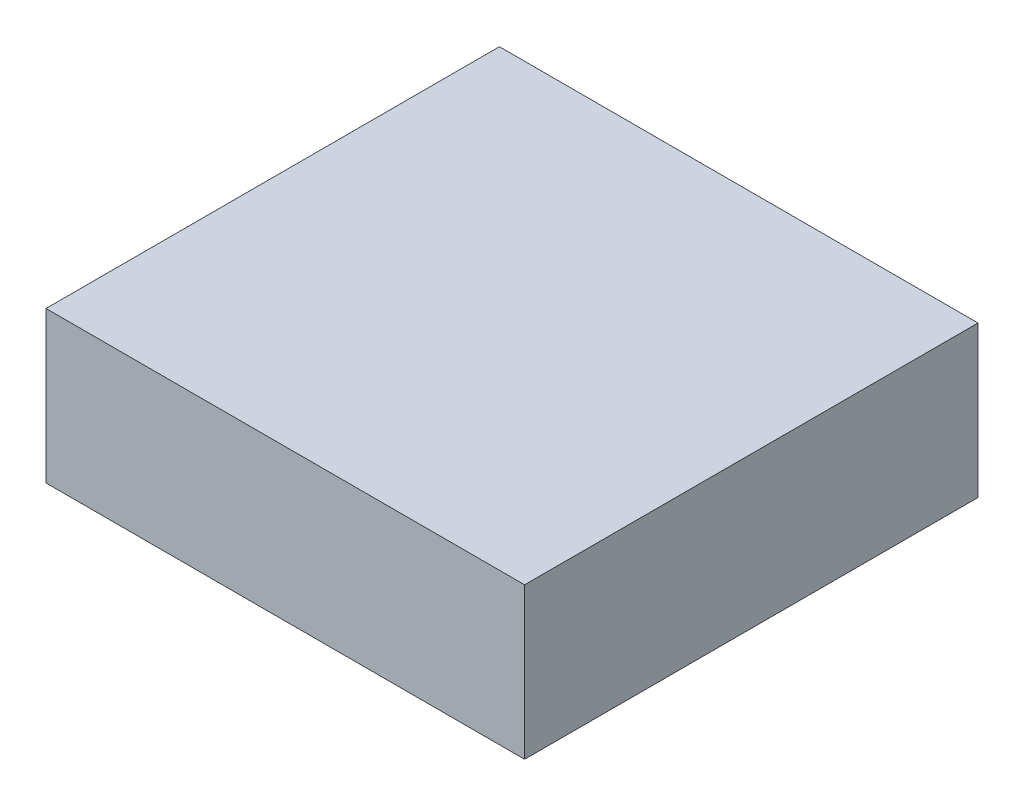
ISO-10303-21;
HEADER;
FILE_DESCRIPTION(('STEP AP214'),'2;1');
FILE_NAME('part.step','',(''),(''),'','','');
FILE_SCHEMA(('AUTOMOTIVE_DESIGN { 1 0 10303 214 1 1 1 1 }'));
ENDSEC;
DATA;
#1=APPLICATION_CONTEXT('core data for automotive mechanical design processes');
#2=APPLICATION_PROTOCOL_DEFINITION('international standard','automotive_design',2000,#1);
#3=PRODUCT_CONTEXT('',#1,'mechanical');
#4=PRODUCT('Part','Part','',(#3));
#5=PRODUCT_RELATED_PRODUCT_CATEGORY('part','',(#4));
#6=PRODUCT_DEFINITION_FORMATION('','',#4);
#7=PRODUCT_DEFINITION_CONTEXT('part definition',#1,'design');
#8=PRODUCT_DEFINITION('design','',#6,#7);
#9=PRODUCT_DEFINITION_SHAPE('','',#8);
#10=(LENGTH_UNIT() NAMED_UNIT(*) SI_UNIT(.MILLI.,.METRE.));
#11=(NAMED_UNIT(*) PLANE_ANGLE_UNIT() SI_UNIT($,.RADIAN.));
#12=(NAMED_UNIT(*) SI_UNIT($,.STERADIAN.) SOLID_ANGLE_UNIT());
#13=UNCERTAINTY_MEASURE_WITH_UNIT(LENGTH_MEASURE(1.E-05),#10,'distance_accuracy_value','');
#14=(GEOMETRIC_REPRESENTATION_CONTEXT(3) GLOBAL_UNCERTAINTY_ASSIGNED_CONTEXT((#13)) GLOBAL_UNIT_ASSIGNED_CONTEXT((#10,
#11,#12)) REPRESENTATION_CONTEXT('',''));
#15=CARTESIAN_POINT('',(0.,0.,0.));
#16=DIRECTION('',(0.,0.,1.));
#17=DIRECTION('',(1.,0.,0.));
#18=AXIS2_PLACEMENT_3D('',#15,#16,#17);
#19=CARTESIAN_POINT('',(0.47500032,0.15000224,0.));
#20=DIRECTION('',(0.,-1.,0.));
#21=DIRECTION('',(0.,0.,-1.));
#22=AXIS2_PLACEMENT_3D('',#19,#20,#21);
#23=PLANE('',#22);
#24=DIRECTION('',(0.,0.,-1.));
#25=VECTOR('',#24,1.);
#26=CARTESIAN_POINT('',(-0.47500032,0.15000224,0.));
#27=LINE('',#26,#25);
#28=CARTESIAN_POINT('',(-0.47500032,0.15000224,0.));
#29=VERTEX_POINT('',#28);
#30=CARTESIAN_POINT('',(-0.47500032,0.15000224,0.90000074));
#31=VERTEX_POINT('',#30);
#32=EDGE_CURVE('E20',#29,#31,#27,.F.);
#33=ORIENTED_EDGE('',*,*,#32,.T.);
#34=DIRECTION('',(-1.,0.,0.));
#35=VECTOR('',#34,1.);
#36=CARTESIAN_POINT('',(-0.47500032,0.15000224,0.90000074));
#37=LINE('',#36,#35);
#38=CARTESIAN_POINT('',(0.47500032,0.15000224,0.90000074));
#39=VERTEX_POINT('',#38);
#40=EDGE_CURVE('E55',#31,#39,#37,.F.);
#41=ORIENTED_EDGE('',*,*,#40,.T.);
#42=DIRECTION('',(0.,0.,1.));
#43=VECTOR('',#42,1.);
#44=CARTESIAN_POINT('',(0.47500032,0.15000224,0.));
#45=LINE('',#44,#43);
#46=CARTESIAN_POINT('',(0.47500032,0.15000224,0.));
#47=VERTEX_POINT('',#46);
#48=EDGE_CURVE('E76',#39,#47,#45,.F.);
#49=ORIENTED_EDGE('',*,*,#48,.T.);
#50=DIRECTION('',(-1.,0.,0.));
#51=VECTOR('',#50,1.);
#52=CARTESIAN_POINT('',(-0.47500032,0.15000224,0.));
#53=LINE('',#52,#51);
#54=EDGE_CURVE('E58',#29,#47,#53,.F.);
#55=ORIENTED_EDGE('',*,*,#54,.F.);
#56=EDGE_LOOP('',(#33,#41,#49,#55));
#57=FACE_BOUND('',#56,.T.);
#58=ADVANCED_FACE('F17',(#57),#23,.F.);
#59=CARTESIAN_POINT('',(-0.47500032,0.15000224,0.));
#60=DIRECTION('',(1.,0.,0.));
#61=DIRECTION('',(0.,0.,-1.));
#62=AXIS2_PLACEMENT_3D('',#59,#60,#61);
#63=PLANE('',#62);
#64=DIRECTION('',(0.,0.,1.));
#65=VECTOR('',#64,1.);
#66=CARTESIAN_POINT('',(-0.47500032,-0.1499997,0.));
#67=LINE('',#66,#65);
#68=CARTESIAN_POINT('',(-0.47500032,-0.1499997,0.));
#69=VERTEX_POINT('',#68);
#70=CARTESIAN_POINT('',(-0.47500032,-0.1499997,0.90000074));
#71=VERTEX_POINT('',#70);
#72=EDGE_CURVE('E73',#69,#71,#67,.T.);
#73=ORIENTED_EDGE('',*,*,#72,.T.);
#74=DIRECTION('',(0.,1.,0.));
#75=VECTOR('',#74,1.);
#76=CARTESIAN_POINT('',(-0.47500032,-0.1499997,0.90000074));
#77=LINE('',#76,#75);
#78=EDGE_CURVE('E63',#71,#31,#77,.T.);
#79=ORIENTED_EDGE('',*,*,#78,.T.);
#80=ORIENTED_EDGE('',*,*,#32,.F.);
#81=DIRECTION('',(0.,1.,0.));
#82=VECTOR('',#81,1.);
#83=CARTESIAN_POINT('',(-0.47500032,-0.1499997,0.));
#84=LINE('',#83,#82);
#85=EDGE_CURVE('E78',#69,#29,#84,.T.);
#86=ORIENTED_EDGE('',*,*,#85,.F.);
#87=EDGE_LOOP('',(#73,#79,#80,#86));
#88=FACE_BOUND('',#87,.T.);
#89=ADVANCED_FACE('F72',(#88),#63,.F.);
#90=CARTESIAN_POINT('',(-0.47500032,-0.1499997,0.90000074));
#91=DIRECTION('',(0.,0.,-1.));
#92=DIRECTION('',(-1.,0.,0.));
#93=AXIS2_PLACEMENT_3D('',#90,#91,#92);
#94=PLANE('',#93);
#95=DIRECTION('',(0.,1.,0.));
#96=VECTOR('',#95,1.);
#97=CARTESIAN_POINT('',(0.47500032,-0.1499997,0.90000074));
#98=LINE('',#97,#96);
#99=CARTESIAN_POINT('',(0.47500032,-0.1499997,0.90000074));
#100=VERTEX_POINT('',#99);
#101=EDGE_CURVE('E69',#100,#39,#98,.T.);
#102=ORIENTED_EDGE('',*,*,#101,.T.);
#103=ORIENTED_EDGE('',*,*,#40,.F.);
#104=ORIENTED_EDGE('',*,*,#78,.F.);
#105=DIRECTION('',(1.,0.,0.));
#106=VECTOR('',#105,1.);
#107=CARTESIAN_POINT('',(-0.47500032,-0.1499997,0.90000074));
#108=LINE('',#107,#106);
#109=EDGE_CURVE('E83',#71,#100,#108,.T.);
#110=ORIENTED_EDGE('',*,*,#109,.T.);
#111=EDGE_LOOP('',(#102,#103,#104,#110));
#112=FACE_BOUND('',#111,.T.);
#113=ADVANCED_FACE('F66',(#112),#94,.F.);
#114=CARTESIAN_POINT('',(0.47500032,-0.1499997,0.));
#115=DIRECTION('',(-1.,0.,0.));
#116=DIRECTION('',(0.,0.,1.));
#117=AXIS2_PLACEMENT_3D('',#114,#115,#116);
#118=PLANE('',#117);
#119=ORIENTED_EDGE('',*,*,#48,.F.);
#120=ORIENTED_EDGE('',*,*,#101,.F.);
#121=DIRECTION('',(0.,0.,1.));
#122=VECTOR('',#121,1.);
#123=CARTESIAN_POINT('',(0.47500032,-0.1499997,0.));
#124=LINE('',#123,#122);
#125=CARTESIAN_POINT('',(0.47500032,-0.1499997,0.));
#126=VERTEX_POINT('',#125);
#127=EDGE_CURVE('E26',#100,#126,#124,.F.);
#128=ORIENTED_EDGE('',*,*,#127,.T.);
#129=DIRECTION('',(0.,1.,0.));
#130=VECTOR('',#129,1.);
#131=CARTESIAN_POINT('',(0.47500032,-0.1499997,0.));
#132=LINE('',#131,#130);
#133=EDGE_CURVE('E34',#47,#126,#132,.F.);
#134=ORIENTED_EDGE('',*,*,#133,.F.);
#135=EDGE_LOOP('',(#119,#120,#128,#134));
#136=FACE_BOUND('',#135,.T.);
#137=ADVANCED_FACE('F88',(#136),#118,.F.);
#138=CARTESIAN_POINT('',(-0.47500032,-0.1499997,0.));
#139=DIRECTION('',(0.,0.,-1.));
#140=DIRECTION('',(-1.,0.,0.));
#141=AXIS2_PLACEMENT_3D('',#138,#139,#140);
#142=PLANE('',#141);
#143=ORIENTED_EDGE('',*,*,#133,.T.);
#144=DIRECTION('',(1.,0.,0.));
#145=VECTOR('',#144,1.);
#146=CARTESIAN_POINT('',(-0.47500032,-0.1499997,0.));
#147=LINE('',#146,#145);
#148=EDGE_CURVE('E11',#126,#69,#147,.F.);
#149=ORIENTED_EDGE('',*,*,#148,.T.);
#150=ORIENTED_EDGE('',*,*,#85,.T.);
#151=ORIENTED_EDGE('',*,*,#54,.T.);
#152=EDGE_LOOP('',(#143,#149,#150,#151));
#153=FACE_BOUND('',#152,.T.);
#154=ADVANCED_FACE('F91',(#153),#142,.T.);
#155=CARTESIAN_POINT('',(-0.47500032,-0.1499997,0.));
#156=DIRECTION('',(0.,1.,0.));
#157=DIRECTION('',(0.,0.,1.));
#158=AXIS2_PLACEMENT_3D('',#155,#156,#157);
#159=PLANE('',#158);
#160=ORIENTED_EDGE('',*,*,#127,.F.);
#161=ORIENTED_EDGE('',*,*,#109,.F.);
#162=ORIENTED_EDGE('',*,*,#72,.F.);
#163=ORIENTED_EDGE('',*,*,#148,.F.);
#164=EDGE_LOOP('',(#160,#161,#162,#163));
#165=FACE_BOUND('',#164,.T.);
#166=ADVANCED_FACE('F90',(#165),#159,.F.);
#167=CLOSED_SHELL('',(#58,#89,#113,#137,#154,#166));
#168=MANIFOLD_SOLID_BREP('B1',#167);
#169=ADVANCED_BREP_SHAPE_REPRESENTATION('',(#18,#168),#14);
#170=SHAPE_DEFINITION_REPRESENTATION(#9,#169);
ENDSEC;
END-ISO-10303-21;
